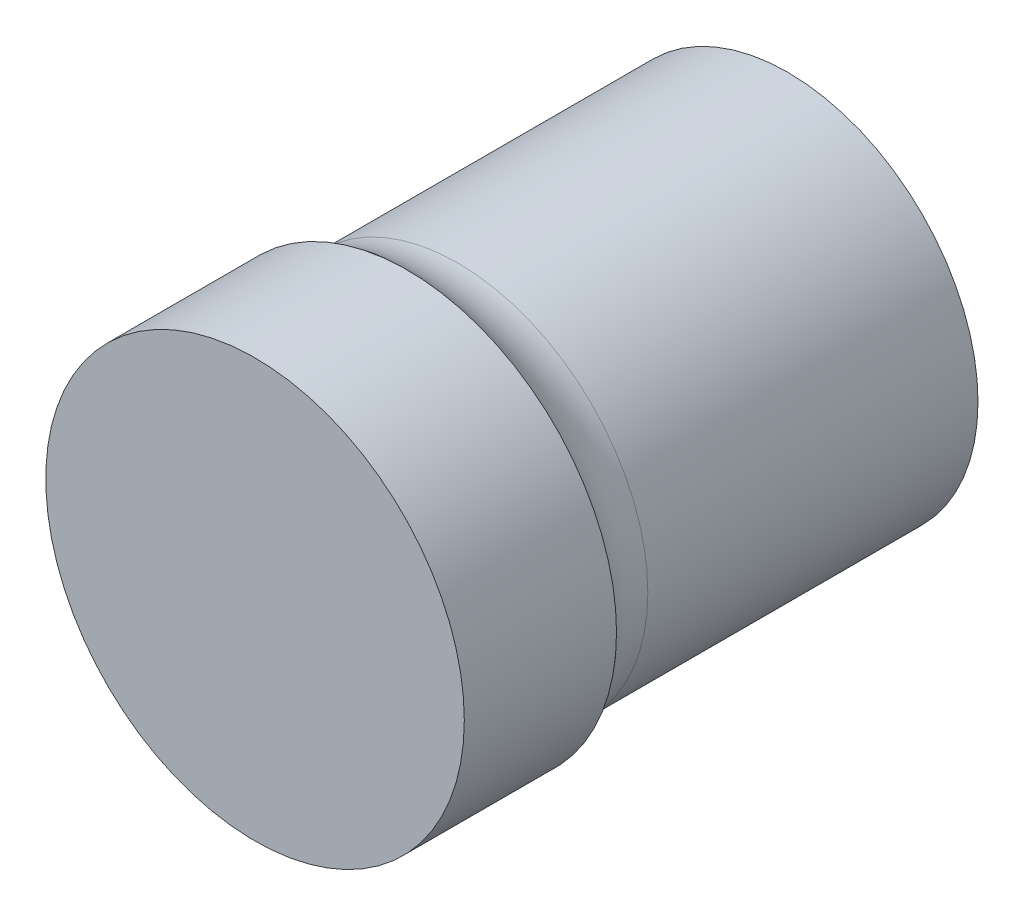
ISO-10303-21;
HEADER;
FILE_DESCRIPTION(('STEP AP214'),'2;1');
FILE_NAME('part.step','',(''),(''),'','','');
FILE_SCHEMA(('AUTOMOTIVE_DESIGN { 1 0 10303 214 1 1 1 1 }'));
ENDSEC;
DATA;
#1=APPLICATION_CONTEXT('core data for automotive mechanical design processes');
#2=APPLICATION_PROTOCOL_DEFINITION('international standard','automotive_design',2000,#1);
#3=PRODUCT_CONTEXT('',#1,'mechanical');
#4=PRODUCT('Part','Part','',(#3));
#5=PRODUCT_RELATED_PRODUCT_CATEGORY('part','',(#4));
#6=PRODUCT_DEFINITION_FORMATION('','',#4);
#7=PRODUCT_DEFINITION_CONTEXT('part definition',#1,'design');
#8=PRODUCT_DEFINITION('design','',#6,#7);
#9=PRODUCT_DEFINITION_SHAPE('','',#8);
#10=(LENGTH_UNIT() NAMED_UNIT(*) SI_UNIT(.MILLI.,.METRE.));
#11=(NAMED_UNIT(*) PLANE_ANGLE_UNIT() SI_UNIT($,.RADIAN.));
#12=(NAMED_UNIT(*) SI_UNIT($,.STERADIAN.) SOLID_ANGLE_UNIT());
#13=UNCERTAINTY_MEASURE_WITH_UNIT(LENGTH_MEASURE(1.E-05),#10,'distance_accuracy_value','');
#14=(GEOMETRIC_REPRESENTATION_CONTEXT(3) GLOBAL_UNCERTAINTY_ASSIGNED_CONTEXT((#13)) GLOBAL_UNIT_ASSIGNED_CONTEXT((#10,
#11,#12)) REPRESENTATION_CONTEXT('',''));
#15=CARTESIAN_POINT('',(0.,0.,0.));
#16=DIRECTION('',(0.,0.,1.));
#17=DIRECTION('',(1.,0.,0.));
#18=AXIS2_PLACEMENT_3D('',#15,#16,#17);
#19=CARTESIAN_POINT('',(0.,0.,0.));
#20=DIRECTION('',(0.,0.,1.));
#21=DIRECTION('',(1.,0.,0.));
#22=AXIS2_PLACEMENT_3D('',#19,#20,#21);
#23=PLANE('',#22);
#24=CARTESIAN_POINT('',(0.,0.,0.));
#25=DIRECTION('',(0.,0.,1.));
#26=DIRECTION('',(1.,0.,0.));
#27=AXIS2_PLACEMENT_3D('',#24,#25,#26);
#28=CIRCLE('',#27,2.5);
#29=CARTESIAN_POINT('',(2.5,0.,0.));
#30=VERTEX_POINT('',#29);
#31=EDGE_CURVE('E44',#30,#30,#28,.T.);
#32=ORIENTED_EDGE('',*,*,#31,.F.);
#33=EDGE_LOOP('',(#32));
#34=FACE_BOUND('',#33,.T.);
#35=CARTESIAN_POINT('',(0.,0.,0.));
#36=DIRECTION('',(0.,0.,1.));
#37=DIRECTION('',(1.,0.,0.));
#38=AXIS2_PLACEMENT_3D('',#35,#36,#37);
#39=CIRCLE('',#38,1.5);
#40=CARTESIAN_POINT('',(1.5,0.,0.));
#41=VERTEX_POINT('',#40);
#42=EDGE_CURVE('E48',#41,#41,#39,.T.);
#43=ORIENTED_EDGE('',*,*,#42,.T.);
#44=EDGE_LOOP('',(#43));
#45=FACE_BOUND('',#44,.T.);
#46=ADVANCED_FACE('F37',(#34,#45),#23,.F.);
#47=CARTESIAN_POINT('',(0.,0.,5.));
#48=DIRECTION('',(0.,0.,-1.));
#49=DIRECTION('',(-1.,0.,0.));
#50=AXIS2_PLACEMENT_3D('',#47,#48,#49);
#51=CYLINDRICAL_SURFACE('',#50,2.5);
#52=CARTESIAN_POINT('',(0.,0.,4.33856217223385));
#53=DIRECTION('',(0.,0.,1.));
#54=DIRECTION('',(1.,0.,0.));
#55=AXIS2_PLACEMENT_3D('',#52,#53,#54);
#56=CIRCLE('',#55,2.5);
#57=CARTESIAN_POINT('',(2.5,0.,4.33856217223385));
#58=VERTEX_POINT('',#57);
#59=EDGE_CURVE('E10',#58,#58,#56,.F.);
#60=ORIENTED_EDGE('',*,*,#59,.T.);
#61=EDGE_LOOP('',(#60));
#62=FACE_BOUND('',#61,.T.);
#63=ORIENTED_EDGE('',*,*,#31,.T.);
#64=EDGE_LOOP('',(#63));
#65=FACE_BOUND('',#64,.T.);
#66=ADVANCED_FACE('F81',(#62,#65),#51,.T.);
#67=CARTESIAN_POINT('',(0.,0.,5.));
#68=DIRECTION('',(0.,0.,-1.));
#69=DIRECTION('',(-1.,0.,0.));
#70=AXIS2_PLACEMENT_3D('',#67,#68,#69);
#71=CYLINDRICAL_SURFACE('',#70,1.5);
#72=CARTESIAN_POINT('',(0.,0.,5.));
#73=DIRECTION('',(0.,0.,1.));
#74=DIRECTION('',(1.,0.,0.));
#75=AXIS2_PLACEMENT_3D('',#72,#73,#74);
#76=CIRCLE('',#75,1.5);
#77=CARTESIAN_POINT('',(1.5,0.,5.));
#78=VERTEX_POINT('',#77);
#79=EDGE_CURVE('E52',#78,#78,#76,.T.);
#80=ORIENTED_EDGE('',*,*,#79,.T.);
#81=EDGE_LOOP('',(#80));
#82=FACE_BOUND('',#81,.T.);
#83=ORIENTED_EDGE('',*,*,#42,.F.);
#84=EDGE_LOOP('',(#83));
#85=FACE_BOUND('',#84,.T.);
#86=ADVANCED_FACE('F87',(#82,#85),#71,.F.);
#87=CARTESIAN_POINT('',(0.,0.,5.));
#88=DIRECTION('',(0.,0.,1.));
#89=DIRECTION('',(1.,0.,0.));
#90=AXIS2_PLACEMENT_3D('',#87,#88,#89);
#91=PLANE('',#90);
#92=ORIENTED_EDGE('',*,*,#79,.F.);
#93=EDGE_LOOP('',(#92));
#94=FACE_BOUND('',#93,.T.);
#95=ADVANCED_FACE('F69',(#94),#91,.F.);
#96=CARTESIAN_POINT('',(0.,0.,7.));
#97=DIRECTION('',(0.,0.,-1.));
#98=DIRECTION('',(-1.,0.,0.));
#99=AXIS2_PLACEMENT_3D('',#96,#97,#98);
#100=CYLINDRICAL_SURFACE('',#99,2.75);
#101=CARTESIAN_POINT('',(0.,0.,7.));
#102=DIRECTION('',(0.,0.,1.));
#103=DIRECTION('',(1.,0.,0.));
#104=AXIS2_PLACEMENT_3D('',#101,#102,#103);
#105=CIRCLE('',#104,2.75);
#106=CARTESIAN_POINT('',(2.75,0.,7.));
#107=VERTEX_POINT('',#106);
#108=EDGE_CURVE('E57',#107,#107,#105,.T.);
#109=ORIENTED_EDGE('',*,*,#108,.F.);
#110=EDGE_LOOP('',(#109));
#111=FACE_BOUND('',#110,.T.);
#112=CARTESIAN_POINT('',(0.,0.,5.));
#113=DIRECTION('',(0.,0.,1.));
#114=DIRECTION('',(1.,0.,0.));
#115=AXIS2_PLACEMENT_3D('',#112,#113,#114);
#116=CIRCLE('',#115,2.75);
#117=CARTESIAN_POINT('',(2.75,0.,5.));
#118=VERTEX_POINT('',#117);
#119=EDGE_CURVE('E58',#118,#118,#116,.T.);
#120=ORIENTED_EDGE('',*,*,#119,.T.);
#121=EDGE_LOOP('',(#120));
#122=FACE_BOUND('',#121,.T.);
#123=ADVANCED_FACE('F66',(#111,#122),#100,.T.);
#124=CARTESIAN_POINT('',(0.,0.,7.));
#125=DIRECTION('',(0.,0.,1.));
#126=DIRECTION('',(1.,0.,0.));
#127=AXIS2_PLACEMENT_3D('',#124,#125,#126);
#128=PLANE('',#127);
#129=ORIENTED_EDGE('',*,*,#108,.T.);
#130=EDGE_LOOP('',(#129));
#131=FACE_BOUND('',#130,.T.);
#132=ADVANCED_FACE('F64',(#131),#128,.T.);
#133=CARTESIAN_POINT('',(0.,0.,4.33856217223385));
#134=DIRECTION('',(0.,0.,1.));
#135=DIRECTION('',(1.,0.,0.));
#136=AXIS2_PLACEMENT_3D('',#133,#134,#135);
#137=TOROIDAL_SURFACE('',#136,3.5,1.);
#138=ORIENTED_EDGE('',*,*,#59,.F.);
#139=EDGE_LOOP('',(#138));
#140=FACE_BOUND('',#139,.T.);
#141=ORIENTED_EDGE('',*,*,#119,.F.);
#142=EDGE_LOOP('',(#141));
#143=FACE_BOUND('',#142,.T.);
#144=ADVANCED_FACE('F39',(#140,#143),#137,.F.);
#145=CLOSED_SHELL('',(#46,#66,#86,#95,#123,#132,#144));
#146=MANIFOLD_SOLID_BREP('B2',#145);
#147=ADVANCED_BREP_SHAPE_REPRESENTATION('',(#18,#146),#14);
#148=SHAPE_DEFINITION_REPRESENTATION(#9,#147);
ENDSEC;
END-ISO-10303-21;
